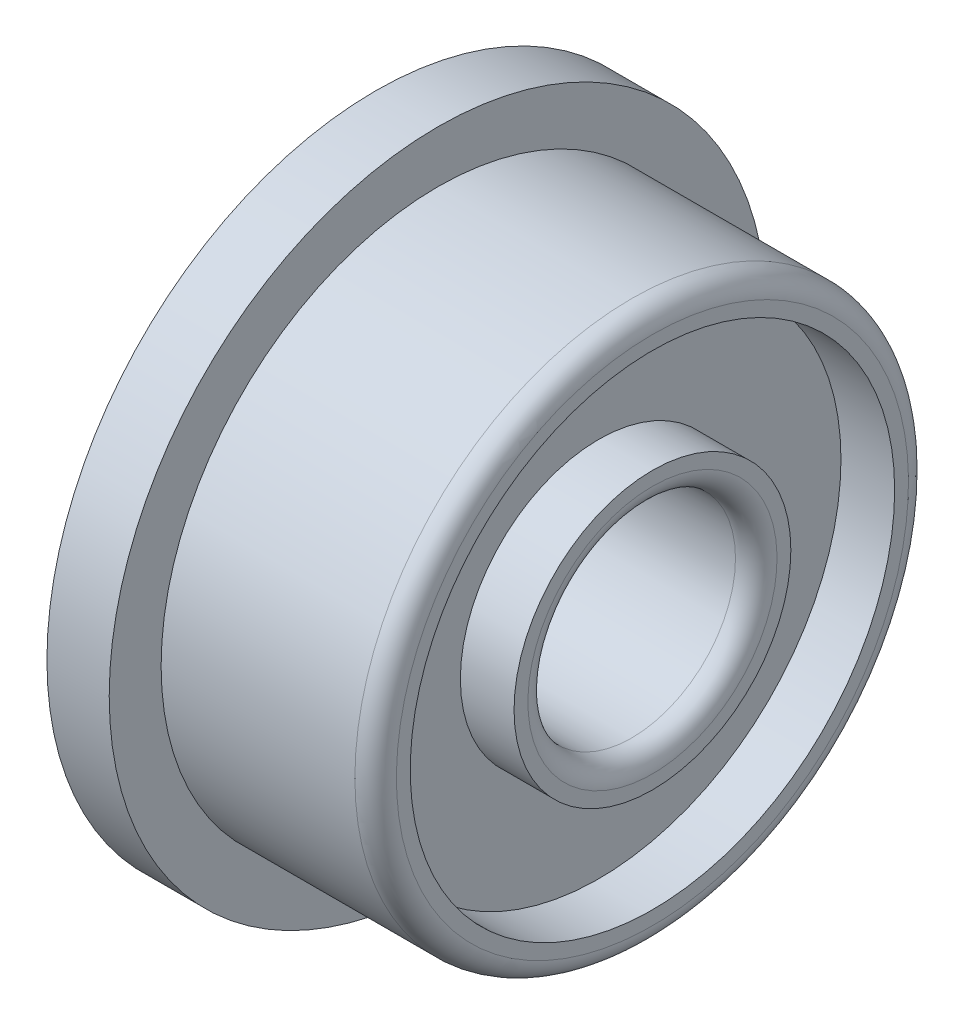
ISO-10303-21;
HEADER;
FILE_DESCRIPTION(('STEP AP214'),'2;1');
FILE_NAME('part.step','',(''),(''),'','','');
FILE_SCHEMA(('AUTOMOTIVE_DESIGN { 1 0 10303 214 1 1 1 1 }'));
ENDSEC;
DATA;
#1=APPLICATION_CONTEXT('core data for automotive mechanical design processes');
#2=APPLICATION_PROTOCOL_DEFINITION('international standard','automotive_design',2000,#1);
#3=PRODUCT_CONTEXT('',#1,'mechanical');
#4=PRODUCT('Part','Part','',(#3));
#5=PRODUCT_RELATED_PRODUCT_CATEGORY('part','',(#4));
#6=PRODUCT_DEFINITION_FORMATION('','',#4);
#7=PRODUCT_DEFINITION_CONTEXT('part definition',#1,'design');
#8=PRODUCT_DEFINITION('design','',#6,#7);
#9=PRODUCT_DEFINITION_SHAPE('','',#8);
#10=(LENGTH_UNIT() NAMED_UNIT(*) SI_UNIT(.MILLI.,.METRE.));
#11=(NAMED_UNIT(*) PLANE_ANGLE_UNIT() SI_UNIT($,.RADIAN.));
#12=(NAMED_UNIT(*) SI_UNIT($,.STERADIAN.) SOLID_ANGLE_UNIT());
#13=UNCERTAINTY_MEASURE_WITH_UNIT(LENGTH_MEASURE(1.E-05),#10,'distance_accuracy_value','');
#14=(GEOMETRIC_REPRESENTATION_CONTEXT(3) GLOBAL_UNCERTAINTY_ASSIGNED_CONTEXT((#13)) GLOBAL_UNIT_ASSIGNED_CONTEXT((#10,
#11,#12)) REPRESENTATION_CONTEXT('',''));
#15=CARTESIAN_POINT('',(0.,0.,0.));
#16=DIRECTION('',(0.,0.,1.));
#17=DIRECTION('',(1.,0.,0.));
#18=AXIS2_PLACEMENT_3D('',#15,#16,#17);
#19=CARTESIAN_POINT('',(0.,1.94454364826301,1.94454364826301));
#20=DIRECTION('',(1.,0.,0.));
#21=DIRECTION('',(0.,-0.707106781186548,0.707106781186548));
#22=AXIS2_PLACEMENT_3D('',#19,#20,#21);
#23=SPHERICAL_SURFACE('',#22,0.75);
#24=CARTESIAN_POINT('',(-0.749999999999993,1.94454364826301,1.94454364826301));
#25=VERTEX_POINT('',#24);
#26=VERTEX_LOOP('',#25);
#27=FACE_BOUND('',#26,.T.);
#28=CARTESIAN_POINT('',(0.750000000000007,1.94454364826301,1.94454364826301));
#29=VERTEX_POINT('',#28);
#30=VERTEX_LOOP('',#29);
#31=FACE_BOUND('',#30,.T.);
#32=ADVANCED_FACE('P0_F15',(#27,#31),#23,.T.);
#33=CLOSED_SHELL('',(#32));
#34=MANIFOLD_SOLID_BREP('P0_B1',#33);
#35=CARTESIAN_POINT('',(0.,0.,2.75));
#36=DIRECTION('',(1.,0.,0.));
#37=DIRECTION('',(0.,-1.,0.));
#38=AXIS2_PLACEMENT_3D('',#35,#36,#37);
#39=SPHERICAL_SURFACE('',#38,0.75);
#40=CARTESIAN_POINT('',(-0.749999999999993,0.,2.75));
#41=VERTEX_POINT('',#40);
#42=VERTEX_LOOP('',#41);
#43=FACE_BOUND('',#42,.T.);
#44=CARTESIAN_POINT('',(0.750000000000007,0.,2.75));
#45=VERTEX_POINT('',#44);
#46=VERTEX_LOOP('',#45);
#47=FACE_BOUND('',#46,.T.);
#48=ADVANCED_FACE('P1_F15',(#43,#47),#39,.T.);
#49=CLOSED_SHELL('',(#48));
#50=MANIFOLD_SOLID_BREP('P1_B1',#49);
#51=CARTESIAN_POINT('',(0.,-1.94454364826301,1.94454364826301));
#52=DIRECTION('',(1.,0.,0.));
#53=DIRECTION('',(0.,-0.707106781186548,-0.707106781186548));
#54=AXIS2_PLACEMENT_3D('',#51,#52,#53);
#55=SPHERICAL_SURFACE('',#54,0.75);
#56=CARTESIAN_POINT('',(-0.749999999999993,-1.94454364826301,1.94454364826301));
#57=VERTEX_POINT('',#56);
#58=VERTEX_LOOP('',#57);
#59=FACE_BOUND('',#58,.T.);
#60=CARTESIAN_POINT('',(0.750000000000007,-1.94454364826301,1.94454364826301));
#61=VERTEX_POINT('',#60);
#62=VERTEX_LOOP('',#61);
#63=FACE_BOUND('',#62,.T.);
#64=ADVANCED_FACE('P2_F15',(#59,#63),#55,.T.);
#65=CLOSED_SHELL('',(#64));
#66=MANIFOLD_SOLID_BREP('P2_B1',#65);
#67=CARTESIAN_POINT('',(0.,-2.75,0.));
#68=DIRECTION('',(1.,0.,0.));
#69=DIRECTION('',(0.,0.,-1.));
#70=AXIS2_PLACEMENT_3D('',#67,#68,#69);
#71=SPHERICAL_SURFACE('',#70,0.75);
#72=CARTESIAN_POINT('',(-0.749999999999993,-2.75,0.));
#73=VERTEX_POINT('',#72);
#74=VERTEX_LOOP('',#73);
#75=FACE_BOUND('',#74,.T.);
#76=CARTESIAN_POINT('',(0.750000000000007,-2.75,0.));
#77=VERTEX_POINT('',#76);
#78=VERTEX_LOOP('',#77);
#79=FACE_BOUND('',#78,.T.);
#80=ADVANCED_FACE('P3_F15',(#75,#79),#71,.T.);
#81=CLOSED_SHELL('',(#80));
#82=MANIFOLD_SOLID_BREP('P3_B1',#81);
#83=CARTESIAN_POINT('',(0.,-1.94454364826301,-1.94454364826301));
#84=DIRECTION('',(1.,0.,0.));
#85=DIRECTION('',(0.,0.707106781186548,-0.707106781186548));
#86=AXIS2_PLACEMENT_3D('',#83,#84,#85);
#87=SPHERICAL_SURFACE('',#86,0.75);
#88=CARTESIAN_POINT('',(-0.749999999999993,-1.94454364826301,-1.94454364826301));
#89=VERTEX_POINT('',#88);
#90=VERTEX_LOOP('',#89);
#91=FACE_BOUND('',#90,.T.);
#92=CARTESIAN_POINT('',(0.750000000000007,-1.94454364826301,-1.94454364826301));
#93=VERTEX_POINT('',#92);
#94=VERTEX_LOOP('',#93);
#95=FACE_BOUND('',#94,.T.);
#96=ADVANCED_FACE('P4_F15',(#91,#95),#87,.T.);
#97=CLOSED_SHELL('',(#96));
#98=MANIFOLD_SOLID_BREP('P4_B1',#97);
#99=CARTESIAN_POINT('',(0.,0.,-2.75));
#100=DIRECTION('',(1.,0.,0.));
#101=DIRECTION('',(0.,1.,0.));
#102=AXIS2_PLACEMENT_3D('',#99,#100,#101);
#103=SPHERICAL_SURFACE('',#102,0.75);
#104=CARTESIAN_POINT('',(-0.749999999999993,0.,-2.75));
#105=VERTEX_POINT('',#104);
#106=VERTEX_LOOP('',#105);
#107=FACE_BOUND('',#106,.T.);
#108=CARTESIAN_POINT('',(0.750000000000007,0.,-2.75));
#109=VERTEX_POINT('',#108);
#110=VERTEX_LOOP('',#109);
#111=FACE_BOUND('',#110,.T.);
#112=ADVANCED_FACE('P5_F15',(#107,#111),#103,.T.);
#113=CLOSED_SHELL('',(#112));
#114=MANIFOLD_SOLID_BREP('P5_B1',#113);
#115=CARTESIAN_POINT('',(0.,1.94454364826301,-1.94454364826301));
#116=DIRECTION('',(1.,0.,0.));
#117=DIRECTION('',(0.,0.707106781186548,0.707106781186548));
#118=AXIS2_PLACEMENT_3D('',#115,#116,#117);
#119=SPHERICAL_SURFACE('',#118,0.75);
#120=CARTESIAN_POINT('',(-0.749999999999993,1.94454364826301,-1.94454364826301));
#121=VERTEX_POINT('',#120);
#122=VERTEX_LOOP('',#121);
#123=FACE_BOUND('',#122,.T.);
#124=CARTESIAN_POINT('',(0.750000000000007,1.94454364826301,-1.94454364826301));
#125=VERTEX_POINT('',#124);
#126=VERTEX_LOOP('',#125);
#127=FACE_BOUND('',#126,.T.);
#128=ADVANCED_FACE('P6_F15',(#123,#127),#119,.T.);
#129=CLOSED_SHELL('',(#128));
#130=MANIFOLD_SOLID_BREP('P6_B1',#129);
#131=CARTESIAN_POINT('',(-1.07407407407407,0.,0.));
#132=DIRECTION('',(1.,0.,0.));
#133=DIRECTION('',(0.,0.,-1.));
#134=AXIS2_PLACEMENT_3D('',#131,#132,#133);
#135=PLANE('',#134);
#136=CARTESIAN_POINT('',(-1.07407407407407,0.,0.));
#137=DIRECTION('',(-1.,0.,0.));
#138=DIRECTION('',(0.,0.,1.));
#139=AXIS2_PLACEMENT_3D('',#136,#137,#138);
#140=CIRCLE('',#139,2.);
#141=CARTESIAN_POINT('',(-1.07407407407407,0.,2.));
#142=VERTEX_POINT('',#141);
#143=EDGE_CURVE('P7_E26',#142,#142,#140,.T.);
#144=ORIENTED_EDGE('',*,*,#143,.T.);
#145=EDGE_LOOP('',(#144));
#146=FACE_BOUND('',#145,.T.);
#147=CARTESIAN_POINT('',(-1.07407407407407,0.,0.));
#148=DIRECTION('',(-1.,0.,0.));
#149=DIRECTION('',(0.,0.,1.));
#150=AXIS2_PLACEMENT_3D('',#147,#148,#149);
#151=CIRCLE('',#150,3.65);
#152=CARTESIAN_POINT('',(-1.07407407407407,0.,3.65));
#153=VERTEX_POINT('',#152);
#154=EDGE_CURVE('P7_E17',#153,#153,#151,.T.);
#155=ORIENTED_EDGE('',*,*,#154,.F.);
#156=EDGE_LOOP('',(#155));
#157=FACE_BOUND('',#156,.T.);
#158=ADVANCED_FACE('P7_F14',(#146,#157),#135,.T.);
#159=CARTESIAN_POINT('',(-1.07407407407407,0.,0.));
#160=DIRECTION('',(-1.,0.,0.));
#161=DIRECTION('',(0.,0.,1.));
#162=AXIS2_PLACEMENT_3D('',#159,#160,#161);
#163=CYLINDRICAL_SURFACE('',#162,3.65);
#164=ORIENTED_EDGE('',*,*,#154,.T.);
#165=EDGE_LOOP('',(#164));
#166=FACE_BOUND('',#165,.T.);
#167=CARTESIAN_POINT('',(-1.22407407407408,0.,0.));
#168=DIRECTION('',(-1.,0.,0.));
#169=DIRECTION('',(0.,0.,1.));
#170=AXIS2_PLACEMENT_3D('',#167,#168,#169);
#171=CIRCLE('',#170,3.65);
#172=CARTESIAN_POINT('',(-1.22407407407408,0.,3.65));
#173=VERTEX_POINT('',#172);
#174=EDGE_CURVE('P7_E21',#173,#173,#171,.T.);
#175=ORIENTED_EDGE('',*,*,#174,.F.);
#176=EDGE_LOOP('',(#175));
#177=FACE_BOUND('',#176,.T.);
#178=ADVANCED_FACE('P7_F34',(#166,#177),#163,.T.);
#179=CARTESIAN_POINT('',(-1.22407407407408,0.,0.));
#180=DIRECTION('',(-1.,0.,0.));
#181=DIRECTION('',(0.,0.,1.));
#182=AXIS2_PLACEMENT_3D('',#179,#180,#181);
#183=CYLINDRICAL_SURFACE('',#182,2.);
#184=ORIENTED_EDGE('',*,*,#143,.F.);
#185=EDGE_LOOP('',(#184));
#186=FACE_BOUND('',#185,.T.);
#187=CARTESIAN_POINT('',(-1.22407407407408,0.,0.));
#188=DIRECTION('',(-1.,0.,0.));
#189=DIRECTION('',(0.,0.,1.));
#190=AXIS2_PLACEMENT_3D('',#187,#188,#189);
#191=CIRCLE('',#190,2.);
#192=CARTESIAN_POINT('',(-1.22407407407408,0.,2.));
#193=VERTEX_POINT('',#192);
#194=EDGE_CURVE('P7_E10',#193,#193,#191,.F.);
#195=ORIENTED_EDGE('',*,*,#194,.F.);
#196=EDGE_LOOP('',(#195));
#197=FACE_BOUND('',#196,.T.);
#198=ADVANCED_FACE('P7_F42',(#186,#197),#183,.F.);
#199=CARTESIAN_POINT('',(-1.22407407407408,0.,0.));
#200=DIRECTION('',(-1.,0.,0.));
#201=DIRECTION('',(0.,0.,1.));
#202=AXIS2_PLACEMENT_3D('',#199,#200,#201);
#203=PLANE('',#202);
#204=ORIENTED_EDGE('',*,*,#194,.T.);
#205=EDGE_LOOP('',(#204));
#206=FACE_BOUND('',#205,.T.);
#207=ORIENTED_EDGE('',*,*,#174,.T.);
#208=EDGE_LOOP('',(#207));
#209=FACE_BOUND('',#208,.T.);
#210=ADVANCED_FACE('P7_F43',(#206,#209),#203,.T.);
#211=CLOSED_SHELL('',(#158,#178,#198,#210));
#212=MANIFOLD_SOLID_BREP('P7_B1',#211);
#213=CARTESIAN_POINT('',(1.07407407407407,0.,0.));
#214=DIRECTION('',(-1.,0.,0.));
#215=DIRECTION('',(0.,0.,1.));
#216=AXIS2_PLACEMENT_3D('',#213,#214,#215);
#217=PLANE('',#216);
#218=CARTESIAN_POINT('',(1.07407407407407,0.,0.));
#219=DIRECTION('',(1.,0.,0.));
#220=DIRECTION('',(0.,0.,-1.));
#221=AXIS2_PLACEMENT_3D('',#218,#219,#220);
#222=CIRCLE('',#221,2.);
#223=CARTESIAN_POINT('',(1.07407407407407,0.,-2.));
#224=VERTEX_POINT('',#223);
#225=EDGE_CURVE('P8_E26',#224,#224,#222,.T.);
#226=ORIENTED_EDGE('',*,*,#225,.T.);
#227=EDGE_LOOP('',(#226));
#228=FACE_BOUND('',#227,.T.);
#229=CARTESIAN_POINT('',(1.07407407407407,0.,0.));
#230=DIRECTION('',(1.,0.,0.));
#231=DIRECTION('',(0.,0.,-1.));
#232=AXIS2_PLACEMENT_3D('',#229,#230,#231);
#233=CIRCLE('',#232,3.65);
#234=CARTESIAN_POINT('',(1.07407407407407,0.,-3.65));
#235=VERTEX_POINT('',#234);
#236=EDGE_CURVE('P8_E17',#235,#235,#233,.T.);
#237=ORIENTED_EDGE('',*,*,#236,.F.);
#238=EDGE_LOOP('',(#237));
#239=FACE_BOUND('',#238,.T.);
#240=ADVANCED_FACE('P8_F14',(#228,#239),#217,.T.);
#241=CARTESIAN_POINT('',(1.07407407407407,0.,0.));
#242=DIRECTION('',(1.,0.,0.));
#243=DIRECTION('',(0.,0.,-1.));
#244=AXIS2_PLACEMENT_3D('',#241,#242,#243);
#245=CYLINDRICAL_SURFACE('',#244,3.65);
#246=ORIENTED_EDGE('',*,*,#236,.T.);
#247=EDGE_LOOP('',(#246));
#248=FACE_BOUND('',#247,.T.);
#249=CARTESIAN_POINT('',(1.22407407407408,0.,0.));
#250=DIRECTION('',(1.,0.,0.));
#251=DIRECTION('',(0.,0.,-1.));
#252=AXIS2_PLACEMENT_3D('',#249,#250,#251);
#253=CIRCLE('',#252,3.65);
#254=CARTESIAN_POINT('',(1.22407407407408,0.,-3.65));
#255=VERTEX_POINT('',#254);
#256=EDGE_CURVE('P8_E21',#255,#255,#253,.T.);
#257=ORIENTED_EDGE('',*,*,#256,.F.);
#258=EDGE_LOOP('',(#257));
#259=FACE_BOUND('',#258,.T.);
#260=ADVANCED_FACE('P8_F34',(#248,#259),#245,.T.);
#261=CARTESIAN_POINT('',(1.22407407407408,0.,0.));
#262=DIRECTION('',(1.,0.,0.));
#263=DIRECTION('',(0.,0.,-1.));
#264=AXIS2_PLACEMENT_3D('',#261,#262,#263);
#265=CYLINDRICAL_SURFACE('',#264,2.);
#266=ORIENTED_EDGE('',*,*,#225,.F.);
#267=EDGE_LOOP('',(#266));
#268=FACE_BOUND('',#267,.T.);
#269=CARTESIAN_POINT('',(1.22407407407408,0.,0.));
#270=DIRECTION('',(1.,0.,0.));
#271=DIRECTION('',(0.,0.,-1.));
#272=AXIS2_PLACEMENT_3D('',#269,#270,#271);
#273=CIRCLE('',#272,2.);
#274=CARTESIAN_POINT('',(1.22407407407408,0.,-2.));
#275=VERTEX_POINT('',#274);
#276=EDGE_CURVE('P8_E10',#275,#275,#273,.F.);
#277=ORIENTED_EDGE('',*,*,#276,.F.);
#278=EDGE_LOOP('',(#277));
#279=FACE_BOUND('',#278,.T.);
#280=ADVANCED_FACE('P8_F42',(#268,#279),#265,.F.);
#281=CARTESIAN_POINT('',(1.22407407407408,0.,0.));
#282=DIRECTION('',(1.,0.,0.));
#283=DIRECTION('',(0.,0.,-1.));
#284=AXIS2_PLACEMENT_3D('',#281,#282,#283);
#285=PLANE('',#284);
#286=ORIENTED_EDGE('',*,*,#276,.T.);
#287=EDGE_LOOP('',(#286));
#288=FACE_BOUND('',#287,.T.);
#289=ORIENTED_EDGE('',*,*,#256,.T.);
#290=EDGE_LOOP('',(#289));
#291=FACE_BOUND('',#290,.T.);
#292=ADVANCED_FACE('P8_F43',(#288,#291),#285,.T.);
#293=CLOSED_SHELL('',(#240,#260,#280,#292));
#294=MANIFOLD_SOLID_BREP('P8_B1',#293);
#295=CARTESIAN_POINT('',(0.,2.75,0.));
#296=DIRECTION('',(1.,0.,0.));
#297=DIRECTION('',(0.,0.,1.));
#298=AXIS2_PLACEMENT_3D('',#295,#296,#297);
#299=SPHERICAL_SURFACE('',#298,0.75);
#300=CARTESIAN_POINT('',(-0.749999999999993,2.75,0.));
#301=VERTEX_POINT('',#300);
#302=VERTEX_LOOP('',#301);
#303=FACE_BOUND('',#302,.T.);
#304=CARTESIAN_POINT('',(0.750000000000007,2.75,0.));
#305=VERTEX_POINT('',#304);
#306=VERTEX_LOOP('',#305);
#307=FACE_BOUND('',#306,.T.);
#308=ADVANCED_FACE('P9_F15',(#303,#307),#299,.T.);
#309=CLOSED_SHELL('',(#308));
#310=MANIFOLD_SOLID_BREP('P9_B1',#309);
#311=CARTESIAN_POINT('',(0.,0.,0.));
#312=DIRECTION('',(1.,0.,0.));
#313=DIRECTION('',(0.,1.,0.));
#314=AXIS2_PLACEMENT_3D('',#311,#312,#313);
#315=TOROIDAL_SURFACE('',#314,2.75,0.75);
#316=CARTESIAN_POINT('',(-0.481534007106452,0.,0.));
#317=DIRECTION('',(1.,0.,0.));
#318=DIRECTION('',(0.,0.,-1.));
#319=AXIS2_PLACEMENT_3D('',#316,#317,#318);
#320=CIRCLE('',#319,3.325);
#321=CARTESIAN_POINT('',(-0.481534007106452,0.,-3.325));
#322=VERTEX_POINT('',#321);
#323=EDGE_CURVE('P10_E70',#322,#322,#320,.F.);
#324=ORIENTED_EDGE('',*,*,#323,.T.);
#325=EDGE_LOOP('',(#324));
#326=FACE_BOUND('',#325,.T.);
#327=CARTESIAN_POINT('',(0.481534007106451,0.,0.));
#328=DIRECTION('',(1.,0.,0.));
#329=DIRECTION('',(0.,0.,-1.));
#330=AXIS2_PLACEMENT_3D('',#327,#328,#329);
#331=CIRCLE('',#330,3.325);
#332=CARTESIAN_POINT('',(0.481534007106451,0.,-3.325));
#333=VERTEX_POINT('',#332);
#334=EDGE_CURVE('P10_E66',#333,#333,#331,.T.);
#335=ORIENTED_EDGE('',*,*,#334,.T.);
#336=EDGE_LOOP('',(#335));
#337=FACE_BOUND('',#336,.T.);
#338=ADVANCED_FACE('P10_F14',(#326,#337),#315,.F.);
#339=CARTESIAN_POINT('',(2.00000000000003,0.,0.));
#340=DIRECTION('',(1.,0.,0.));
#341=DIRECTION('',(0.,0.,-1.));
#342=AXIS2_PLACEMENT_3D('',#339,#340,#341);
#343=CYLINDRICAL_SURFACE('',#342,3.325);
#344=CARTESIAN_POINT('',(-1.07407407407407,0.,0.));
#345=DIRECTION('',(1.,0.,0.));
#346=DIRECTION('',(0.,0.,-1.));
#347=AXIS2_PLACEMENT_3D('',#344,#345,#346);
#348=CIRCLE('',#347,3.325);
#349=CARTESIAN_POINT('',(-1.07407407407407,0.,-3.325));
#350=VERTEX_POINT('',#349);
#351=EDGE_CURVE('P10_E18',#350,#350,#348,.F.);
#352=ORIENTED_EDGE('',*,*,#351,.T.);
#353=EDGE_LOOP('',(#352));
#354=FACE_BOUND('',#353,.T.);
#355=ORIENTED_EDGE('',*,*,#323,.F.);
#356=EDGE_LOOP('',(#355));
#357=FACE_BOUND('',#356,.T.);
#358=ADVANCED_FACE('P10_F158',(#354,#357),#343,.F.);
#359=CARTESIAN_POINT('',(2.00000000000003,0.,0.));
#360=DIRECTION('',(1.,0.,0.));
#361=DIRECTION('',(0.,0.,-1.));
#362=AXIS2_PLACEMENT_3D('',#359,#360,#361);
#363=CYLINDRICAL_SURFACE('',#362,3.325);
#364=ORIENTED_EDGE('',*,*,#334,.F.);
#365=EDGE_LOOP('',(#364));
#366=FACE_BOUND('',#365,.T.);
#367=CARTESIAN_POINT('',(1.07407407407408,0.,0.));
#368=DIRECTION('',(1.,0.,0.));
#369=DIRECTION('',(0.,0.,-1.));
#370=AXIS2_PLACEMENT_3D('',#367,#368,#369);
#371=CIRCLE('',#370,3.325);
#372=CARTESIAN_POINT('',(1.07407407407408,0.,-3.325));
#373=VERTEX_POINT('',#372);
#374=EDGE_CURVE('P10_E61',#373,#373,#371,.T.);
#375=ORIENTED_EDGE('',*,*,#374,.T.);
#376=EDGE_LOOP('',(#375));
#377=FACE_BOUND('',#376,.T.);
#378=ADVANCED_FACE('P10_F155',(#366,#377),#363,.F.);
#379=CARTESIAN_POINT('',(-1.07407407407407,0.,0.));
#380=DIRECTION('',(1.,0.,0.));
#381=DIRECTION('',(0.,0.,-1.));
#382=AXIS2_PLACEMENT_3D('',#379,#380,#381);
#383=PLANE('',#382);
#384=ORIENTED_EDGE('',*,*,#351,.F.);
#385=EDGE_LOOP('',(#384));
#386=FACE_BOUND('',#385,.T.);
#387=CARTESIAN_POINT('',(-1.07407407407406,0.,0.));
#388=DIRECTION('',(1.,0.,0.));
#389=DIRECTION('',(0.,0.,-1.));
#390=AXIS2_PLACEMENT_3D('',#387,#388,#389);
#391=CIRCLE('',#390,3.64999999999998);
#392=CARTESIAN_POINT('',(-1.07407407407406,0.,-3.64999999999998));
#393=VERTEX_POINT('',#392);
#394=EDGE_CURVE('P10_E59',#393,#393,#391,.F.);
#395=ORIENTED_EDGE('',*,*,#394,.T.);
#396=EDGE_LOOP('',(#395));
#397=FACE_BOUND('',#396,.T.);
#398=ADVANCED_FACE('P10_F151',(#386,#397),#383,.F.);
#399=CARTESIAN_POINT('',(1.07407407407408,0.,0.));
#400=DIRECTION('',(-1.,0.,0.));
#401=DIRECTION('',(0.,0.,1.));
#402=AXIS2_PLACEMENT_3D('',#399,#400,#401);
#403=PLANE('',#402);
#404=ORIENTED_EDGE('',*,*,#374,.F.);
#405=EDGE_LOOP('',(#404));
#406=FACE_BOUND('',#405,.T.);
#407=CARTESIAN_POINT('',(1.07407407407408,0.,0.));
#408=DIRECTION('',(1.,0.,0.));
#409=DIRECTION('',(0.,0.,-1.));
#410=AXIS2_PLACEMENT_3D('',#407,#408,#409);
#411=CIRCLE('',#410,3.64999999999999);
#412=CARTESIAN_POINT('',(1.07407407407408,0.,-3.64999999999999));
#413=VERTEX_POINT('',#412);
#414=EDGE_CURVE('P10_E56',#413,#413,#411,.T.);
#415=ORIENTED_EDGE('',*,*,#414,.T.);
#416=EDGE_LOOP('',(#415));
#417=FACE_BOUND('',#416,.T.);
#418=ADVANCED_FACE('P10_F147',(#406,#417),#403,.F.);
#419=CARTESIAN_POINT('',(-1.22407407407407,0.,0.));
#420=DIRECTION('',(1.,0.,0.));
#421=DIRECTION('',(0.,0.,-1.));
#422=AXIS2_PLACEMENT_3D('',#419,#420,#421);
#423=CYLINDRICAL_SURFACE('',#422,3.64999999999998);
#424=CARTESIAN_POINT('',(-1.22407407407407,0.,0.));
#425=DIRECTION('',(1.,0.,0.));
#426=DIRECTION('',(0.,0.,-1.));
#427=AXIS2_PLACEMENT_3D('',#424,#425,#426);
#428=CIRCLE('',#427,3.64999999999998);
#429=CARTESIAN_POINT('',(-1.22407407407407,0.,-3.64999999999998));
#430=VERTEX_POINT('',#429);
#431=EDGE_CURVE('P10_E53',#430,#430,#428,.F.);
#432=ORIENTED_EDGE('',*,*,#431,.T.);
#433=EDGE_LOOP('',(#432));
#434=FACE_BOUND('',#433,.T.);
#435=ORIENTED_EDGE('',*,*,#394,.F.);
#436=EDGE_LOOP('',(#435));
#437=FACE_BOUND('',#436,.T.);
#438=ADVANCED_FACE('P10_F143',(#434,#437),#423,.F.);
#439=CARTESIAN_POINT('',(1.07407407407408,0.,0.));
#440=DIRECTION('',(1.,0.,0.));
#441=DIRECTION('',(0.,0.,-1.));
#442=AXIS2_PLACEMENT_3D('',#439,#440,#441);
#443=CYLINDRICAL_SURFACE('',#442,3.64999999999999);
#444=ORIENTED_EDGE('',*,*,#414,.F.);
#445=EDGE_LOOP('',(#444));
#446=FACE_BOUND('',#445,.T.);
#447=CARTESIAN_POINT('',(1.22407407407407,0.,0.));
#448=DIRECTION('',(1.,0.,0.));
#449=DIRECTION('',(0.,0.,-1.));
#450=AXIS2_PLACEMENT_3D('',#447,#448,#449);
#451=CIRCLE('',#450,3.64999999999999);
#452=CARTESIAN_POINT('',(1.22407407407407,0.,-3.64999999999999));
#453=VERTEX_POINT('',#452);
#454=EDGE_CURVE('P10_E50',#453,#453,#451,.T.);
#455=ORIENTED_EDGE('',*,*,#454,.T.);
#456=EDGE_LOOP('',(#455));
#457=FACE_BOUND('',#456,.T.);
#458=ADVANCED_FACE('P10_F139',(#446,#457),#443,.F.);
#459=CARTESIAN_POINT('',(-1.22407407407407,0.,0.));
#460=DIRECTION('',(-1.,0.,0.));
#461=DIRECTION('',(0.,0.,1.));
#462=AXIS2_PLACEMENT_3D('',#459,#460,#461);
#463=PLANE('',#462);
#464=CARTESIAN_POINT('',(-1.22407407407407,0.,0.));
#465=DIRECTION('',(1.,0.,0.));
#466=DIRECTION('',(0.,0.,-1.));
#467=AXIS2_PLACEMENT_3D('',#464,#465,#466);
#468=CIRCLE('',#467,3.5);
#469=CARTESIAN_POINT('',(-1.22407407407407,0.,-3.5));
#470=VERTEX_POINT('',#469);
#471=EDGE_CURVE('P10_E47',#470,#470,#468,.F.);
#472=ORIENTED_EDGE('',*,*,#471,.T.);
#473=EDGE_LOOP('',(#472));
#474=FACE_BOUND('',#473,.T.);
#475=ORIENTED_EDGE('',*,*,#431,.F.);
#476=EDGE_LOOP('',(#475));
#477=FACE_BOUND('',#476,.T.);
#478=ADVANCED_FACE('P10_F135',(#474,#477),#463,.F.);
#479=CARTESIAN_POINT('',(1.22407407407407,0.,0.));
#480=DIRECTION('',(1.,0.,0.));
#481=DIRECTION('',(0.,0.,-1.));
#482=AXIS2_PLACEMENT_3D('',#479,#480,#481);
#483=PLANE('',#482);
#484=CARTESIAN_POINT('',(1.22407407407407,0.,0.));
#485=DIRECTION('',(1.,0.,0.));
#486=DIRECTION('',(0.,0.,-1.));
#487=AXIS2_PLACEMENT_3D('',#484,#485,#486);
#488=CIRCLE('',#487,3.49999999999999);
#489=CARTESIAN_POINT('',(1.22407407407407,0.,-3.49999999999999));
#490=VERTEX_POINT('',#489);
#491=EDGE_CURVE('P10_E44',#490,#490,#488,.T.);
#492=ORIENTED_EDGE('',*,*,#491,.T.);
#493=EDGE_LOOP('',(#492));
#494=FACE_BOUND('',#493,.T.);
#495=ORIENTED_EDGE('',*,*,#454,.F.);
#496=EDGE_LOOP('',(#495));
#497=FACE_BOUND('',#496,.T.);
#498=ADVANCED_FACE('P10_F131',(#494,#497),#483,.F.);
#499=CARTESIAN_POINT('',(-2.,0.,0.));
#500=DIRECTION('',(1.,0.,0.));
#501=DIRECTION('',(0.,0.,-1.));
#502=AXIS2_PLACEMENT_3D('',#499,#500,#501);
#503=CYLINDRICAL_SURFACE('',#502,3.5);
#504=CARTESIAN_POINT('',(-2.,0.,0.));
#505=DIRECTION('',(1.,0.,0.));
#506=DIRECTION('',(0.,0.,-1.));
#507=AXIS2_PLACEMENT_3D('',#504,#505,#506);
#508=CIRCLE('',#507,3.5);
#509=CARTESIAN_POINT('',(-2.,0.,-3.5));
#510=VERTEX_POINT('',#509);
#511=EDGE_CURVE('P10_E41',#510,#510,#508,.T.);
#512=ORIENTED_EDGE('',*,*,#511,.F.);
#513=EDGE_LOOP('',(#512));
#514=FACE_BOUND('',#513,.T.);
#515=ORIENTED_EDGE('',*,*,#471,.F.);
#516=EDGE_LOOP('',(#515));
#517=FACE_BOUND('',#516,.T.);
#518=ADVANCED_FACE('P10_F127',(#514,#517),#503,.F.);
#519=CARTESIAN_POINT('',(1.22407407407407,0.,0.));
#520=DIRECTION('',(1.,0.,0.));
#521=DIRECTION('',(0.,0.,-1.));
#522=AXIS2_PLACEMENT_3D('',#519,#520,#521);
#523=CYLINDRICAL_SURFACE('',#522,3.49999999999999);
#524=ORIENTED_EDGE('',*,*,#491,.F.);
#525=EDGE_LOOP('',(#524));
#526=FACE_BOUND('',#525,.T.);
#527=CARTESIAN_POINT('',(2.,0.,0.));
#528=DIRECTION('',(1.,0.,0.));
#529=DIRECTION('',(0.,0.,-1.));
#530=AXIS2_PLACEMENT_3D('',#527,#528,#529);
#531=CIRCLE('',#530,3.49999999999999);
#532=CARTESIAN_POINT('',(2.,0.,-3.49999999999999));
#533=VERTEX_POINT('',#532);
#534=EDGE_CURVE('P10_E38',#533,#533,#531,.F.);
#535=ORIENTED_EDGE('',*,*,#534,.F.);
#536=EDGE_LOOP('',(#535));
#537=FACE_BOUND('',#536,.T.);
#538=ADVANCED_FACE('P10_F123',(#526,#537),#523,.F.);
#539=CARTESIAN_POINT('',(-1.99999999999999,0.,0.));
#540=DIRECTION('',(-1.,0.,0.));
#541=DIRECTION('',(0.,0.,1.));
#542=AXIS2_PLACEMENT_3D('',#539,#540,#541);
#543=PLANE('',#542);
#544=ORIENTED_EDGE('',*,*,#511,.T.);
#545=EDGE_LOOP('',(#544));
#546=FACE_BOUND('',#545,.T.);
#547=CARTESIAN_POINT('',(-1.99999999999999,0.,0.));
#548=DIRECTION('',(1.,0.,0.));
#549=DIRECTION('',(0.,0.,-1.));
#550=AXIS2_PLACEMENT_3D('',#547,#548,#549);
#551=CIRCLE('',#550,4.75000000000001);
#552=CARTESIAN_POINT('',(-1.99999999999999,0.,-4.75000000000001));
#553=VERTEX_POINT('',#552);
#554=EDGE_CURVE('P10_E35',#553,#553,#551,.T.);
#555=ORIENTED_EDGE('',*,*,#554,.F.);
#556=EDGE_LOOP('',(#555));
#557=FACE_BOUND('',#556,.T.);
#558=ADVANCED_FACE('P10_F119',(#546,#557),#543,.T.);
#559=CARTESIAN_POINT('',(2.00000000000003,0.,0.));
#560=DIRECTION('',(1.,0.,0.));
#561=DIRECTION('',(0.,0.,-1.));
#562=AXIS2_PLACEMENT_3D('',#559,#560,#561);
#563=PLANE('',#562);
#564=ORIENTED_EDGE('',*,*,#534,.T.);
#565=EDGE_LOOP('',(#564));
#566=FACE_BOUND('',#565,.T.);
#567=CARTESIAN_POINT('',(2.00000000000003,0.,0.));
#568=DIRECTION('',(-1.,0.,0.));
#569=DIRECTION('',(0.,1.,0.));
#570=AXIS2_PLACEMENT_3D('',#567,#568,#569);
#571=CIRCLE('',#570,3.7);
#572=CARTESIAN_POINT('',(2.00000000000003,3.7,0.));
#573=VERTEX_POINT('',#572);
#574=EDGE_CURVE('P10_E34',#573,#573,#571,.T.);
#575=ORIENTED_EDGE('',*,*,#574,.F.);
#576=EDGE_LOOP('',(#575));
#577=FACE_BOUND('',#576,.T.);
#578=ADVANCED_FACE('P10_F110',(#566,#577),#563,.T.);
#579=CARTESIAN_POINT('',(-1.99999999999999,0.,0.));
#580=DIRECTION('',(1.,0.,0.));
#581=DIRECTION('',(0.,0.,-1.));
#582=AXIS2_PLACEMENT_3D('',#579,#580,#581);
#583=CYLINDRICAL_SURFACE('',#582,4.75000000000001);
#584=ORIENTED_EDGE('',*,*,#554,.T.);
#585=EDGE_LOOP('',(#584));
#586=FACE_BOUND('',#585,.T.);
#587=CARTESIAN_POINT('',(-1.09999999999999,0.,0.));
#588=DIRECTION('',(1.,0.,0.));
#589=DIRECTION('',(0.,0.,-1.));
#590=AXIS2_PLACEMENT_3D('',#587,#588,#589);
#591=CIRCLE('',#590,4.75000000000001);
#592=CARTESIAN_POINT('',(-1.09999999999999,0.,-4.75000000000001));
#593=VERTEX_POINT('',#592);
#594=EDGE_CURVE('P10_E27',#593,#593,#591,.T.);
#595=ORIENTED_EDGE('',*,*,#594,.F.);
#596=EDGE_LOOP('',(#595));
#597=FACE_BOUND('',#596,.T.);
#598=ADVANCED_FACE('P10_F98',(#586,#597),#583,.T.);
#599=CARTESIAN_POINT('',(1.70000000000003,0.,0.));
#600=DIRECTION('',(1.,0.,0.));
#601=DIRECTION('',(0.,1.,0.));
#602=AXIS2_PLACEMENT_3D('',#599,#600,#601);
#603=TOROIDAL_SURFACE('',#602,3.7,0.3);
#604=CARTESIAN_POINT('',(1.70000000000003,0.,0.));
#605=DIRECTION('',(1.,0.,0.));
#606=DIRECTION('',(0.,0.,-1.));
#607=AXIS2_PLACEMENT_3D('',#604,#605,#606);
#608=CIRCLE('',#607,4.);
#609=CARTESIAN_POINT('',(1.70000000000003,0.,-4.));
#610=VERTEX_POINT('',#609);
#611=EDGE_CURVE('P10_E22',#610,#610,#608,.F.);
#612=ORIENTED_EDGE('',*,*,#611,.F.);
#613=EDGE_LOOP('',(#612));
#614=FACE_BOUND('',#613,.T.);
#615=ORIENTED_EDGE('',*,*,#574,.T.);
#616=EDGE_LOOP('',(#615));
#617=FACE_BOUND('',#616,.T.);
#618=ADVANCED_FACE('P10_F86',(#614,#617),#603,.T.);
#619=CARTESIAN_POINT('',(-1.09999999999999,0.,0.));
#620=DIRECTION('',(1.,0.,0.));
#621=DIRECTION('',(0.,0.,-1.));
#622=AXIS2_PLACEMENT_3D('',#619,#620,#621);
#623=PLANE('',#622);
#624=CARTESIAN_POINT('',(-1.09999999999999,0.,0.));
#625=DIRECTION('',(1.,0.,0.));
#626=DIRECTION('',(0.,0.,-1.));
#627=AXIS2_PLACEMENT_3D('',#624,#625,#626);
#628=CIRCLE('',#627,4.);
#629=CARTESIAN_POINT('',(-1.09999999999999,0.,-4.));
#630=VERTEX_POINT('',#629);
#631=EDGE_CURVE('P10_E10',#630,#630,#628,.T.);
#632=ORIENTED_EDGE('',*,*,#631,.F.);
#633=EDGE_LOOP('',(#632));
#634=FACE_BOUND('',#633,.T.);
#635=ORIENTED_EDGE('',*,*,#594,.T.);
#636=EDGE_LOOP('',(#635));
#637=FACE_BOUND('',#636,.T.);
#638=ADVANCED_FACE('P10_F97',(#634,#637),#623,.T.);
#639=CARTESIAN_POINT('',(-1.99999999999999,0.,0.));
#640=DIRECTION('',(1.,0.,0.));
#641=DIRECTION('',(0.,0.,-1.));
#642=AXIS2_PLACEMENT_3D('',#639,#640,#641);
#643=CYLINDRICAL_SURFACE('',#642,4.);
#644=ORIENTED_EDGE('',*,*,#631,.T.);
#645=EDGE_LOOP('',(#644));
#646=FACE_BOUND('',#645,.T.);
#647=ORIENTED_EDGE('',*,*,#611,.T.);
#648=EDGE_LOOP('',(#647));
#649=FACE_BOUND('',#648,.T.);
#650=ADVANCED_FACE('P10_F167',(#646,#649),#643,.T.);
#651=CLOSED_SHELL('',(#338,#358,#378,#398,#418,#438,#458,#478,#498,#518,#538,#558,#578,#598,
#618,#638,#650));
#652=MANIFOLD_SOLID_BREP('P10_B1',#651);
#653=CARTESIAN_POINT('',(0.,0.,0.));
#654=DIRECTION('',(1.,0.,0.));
#655=DIRECTION('',(0.,1.,0.));
#656=AXIS2_PLACEMENT_3D('',#653,#654,#655);
#657=TOROIDAL_SURFACE('',#656,2.75,0.75);
#658=CARTESIAN_POINT('',(-0.481534007106446,0.,0.));
#659=DIRECTION('',(1.,0.,0.));
#660=DIRECTION('',(0.,0.,-1.));
#661=AXIS2_PLACEMENT_3D('',#658,#659,#660);
#662=CIRCLE('',#661,2.17499999999999);
#663=CARTESIAN_POINT('',(-0.481534007106446,0.,-2.17499999999999));
#664=VERTEX_POINT('',#663);
#665=EDGE_CURVE('P11_E140',#664,#664,#662,.F.);
#666=ORIENTED_EDGE('',*,*,#665,.F.);
#667=EDGE_LOOP('',(#666));
#668=FACE_BOUND('',#667,.T.);
#669=CARTESIAN_POINT('',(0.481534007106446,0.,0.));
#670=DIRECTION('',(1.,0.,0.));
#671=DIRECTION('',(0.,0.,-1.));
#672=AXIS2_PLACEMENT_3D('',#669,#670,#671);
#673=CIRCLE('',#672,2.17499999999999);
#674=CARTESIAN_POINT('',(0.481534007106446,0.,-2.17499999999999));
#675=VERTEX_POINT('',#674);
#676=EDGE_CURVE('P11_E143',#675,#675,#673,.T.);
#677=ORIENTED_EDGE('',*,*,#676,.F.);
#678=EDGE_LOOP('',(#677));
#679=FACE_BOUND('',#678,.T.);
#680=ADVANCED_FACE('P11_F14',(#668,#679),#657,.F.);
#681=CARTESIAN_POINT('',(-1.99999999999999,0.,0.));
#682=DIRECTION('',(1.,0.,0.));
#683=DIRECTION('',(0.,0.,-1.));
#684=AXIS2_PLACEMENT_3D('',#681,#682,#683);
#685=CYLINDRICAL_SURFACE('',#684,2.17499999999999);
#686=ORIENTED_EDGE('',*,*,#676,.T.);
#687=EDGE_LOOP('',(#686));
#688=FACE_BOUND('',#687,.T.);
#689=CARTESIAN_POINT('',(1.07407407407409,0.,0.));
#690=DIRECTION('',(1.,0.,0.));
#691=DIRECTION('',(0.,0.,-1.));
#692=AXIS2_PLACEMENT_3D('',#689,#690,#691);
#693=CIRCLE('',#692,2.17499999999999);
#694=CARTESIAN_POINT('',(1.07407407407409,0.,-2.17499999999999));
#695=VERTEX_POINT('',#694);
#696=EDGE_CURVE('P11_E18',#695,#695,#693,.F.);
#697=ORIENTED_EDGE('',*,*,#696,.T.);
#698=EDGE_LOOP('',(#697));
#699=FACE_BOUND('',#698,.T.);
#700=ADVANCED_FACE('P11_F100',(#688,#699),#685,.T.);
#701=CARTESIAN_POINT('',(-1.99999999999999,0.,0.));
#702=DIRECTION('',(1.,0.,0.));
#703=DIRECTION('',(0.,0.,-1.));
#704=AXIS2_PLACEMENT_3D('',#701,#702,#703);
#705=CYLINDRICAL_SURFACE('',#704,2.17499999999999);
#706=CARTESIAN_POINT('',(-1.07407407407407,0.,0.));
#707=DIRECTION('',(1.,0.,0.));
#708=DIRECTION('',(0.,0.,-1.));
#709=AXIS2_PLACEMENT_3D('',#706,#707,#708);
#710=CIRCLE('',#709,2.17499999999999);
#711=CARTESIAN_POINT('',(-1.07407407407407,0.,-2.17499999999999));
#712=VERTEX_POINT('',#711);
#713=EDGE_CURVE('P11_E136',#712,#712,#710,.T.);
#714=ORIENTED_EDGE('',*,*,#713,.T.);
#715=EDGE_LOOP('',(#714));
#716=FACE_BOUND('',#715,.T.);
#717=ORIENTED_EDGE('',*,*,#665,.T.);
#718=EDGE_LOOP('',(#717));
#719=FACE_BOUND('',#718,.T.);
#720=ADVANCED_FACE('P11_F97',(#716,#719),#705,.T.);
#721=CARTESIAN_POINT('',(1.07407407407409,0.,0.));
#722=DIRECTION('',(-1.,0.,0.));
#723=DIRECTION('',(0.,0.,1.));
#724=AXIS2_PLACEMENT_3D('',#721,#722,#723);
#725=PLANE('',#724);
#726=CARTESIAN_POINT('',(1.07407407407409,0.,0.));
#727=DIRECTION('',(1.,0.,0.));
#728=DIRECTION('',(0.,0.,-1.));
#729=AXIS2_PLACEMENT_3D('',#726,#727,#728);
#730=CIRCLE('',#729,1.99999999999999);
#731=CARTESIAN_POINT('',(1.07407407407409,0.,-1.99999999999999));
#732=VERTEX_POINT('',#731);
#733=EDGE_CURVE('P11_E134',#732,#732,#730,.T.);
#734=ORIENTED_EDGE('',*,*,#733,.F.);
#735=EDGE_LOOP('',(#734));
#736=FACE_BOUND('',#735,.T.);
#737=ORIENTED_EDGE('',*,*,#696,.F.);
#738=EDGE_LOOP('',(#737));
#739=FACE_BOUND('',#738,.T.);
#740=ADVANCED_FACE('P11_F93',(#736,#739),#725,.F.);
#741=CARTESIAN_POINT('',(-1.07407407407407,0.,0.));
#742=DIRECTION('',(1.,0.,0.));
#743=DIRECTION('',(0.,0.,-1.));
#744=AXIS2_PLACEMENT_3D('',#741,#742,#743);
#745=PLANE('',#744);
#746=CARTESIAN_POINT('',(-1.07407407407407,0.,0.));
#747=DIRECTION('',(1.,0.,0.));
#748=DIRECTION('',(0.,0.,-1.));
#749=AXIS2_PLACEMENT_3D('',#746,#747,#748);
#750=CIRCLE('',#749,2.);
#751=CARTESIAN_POINT('',(-1.07407407407407,0.,-2.));
#752=VERTEX_POINT('',#751);
#753=EDGE_CURVE('P11_E127',#752,#752,#750,.F.);
#754=ORIENTED_EDGE('',*,*,#753,.F.);
#755=EDGE_LOOP('',(#754));
#756=FACE_BOUND('',#755,.T.);
#757=ORIENTED_EDGE('',*,*,#713,.F.);
#758=EDGE_LOOP('',(#757));
#759=FACE_BOUND('',#758,.T.);
#760=ADVANCED_FACE('P11_F89',(#756,#759),#745,.F.);
#761=CARTESIAN_POINT('',(2.00000000000001,0.,0.));
#762=DIRECTION('',(1.,0.,0.));
#763=DIRECTION('',(0.,0.,-1.));
#764=AXIS2_PLACEMENT_3D('',#761,#762,#763);
#765=CYLINDRICAL_SURFACE('',#764,1.99999999999999);
#766=ORIENTED_EDGE('',*,*,#733,.T.);
#767=EDGE_LOOP('',(#766));
#768=FACE_BOUND('',#767,.T.);
#769=CARTESIAN_POINT('',(2.00000000000001,0.,0.));
#770=DIRECTION('',(1.,0.,0.));
#771=DIRECTION('',(0.,0.,-1.));
#772=AXIS2_PLACEMENT_3D('',#769,#770,#771);
#773=CIRCLE('',#772,1.99999999999999);
#774=CARTESIAN_POINT('',(2.00000000000001,0.,-1.99999999999999));
#775=VERTEX_POINT('',#774);
#776=EDGE_CURVE('P11_E122',#775,#775,#773,.T.);
#777=ORIENTED_EDGE('',*,*,#776,.F.);
#778=EDGE_LOOP('',(#777));
#779=FACE_BOUND('',#778,.T.);
#780=ADVANCED_FACE('P11_F85',(#768,#779),#765,.T.);
#781=CARTESIAN_POINT('',(-1.07407407407407,0.,0.));
#782=DIRECTION('',(1.,0.,0.));
#783=DIRECTION('',(0.,0.,-1.));
#784=AXIS2_PLACEMENT_3D('',#781,#782,#783);
#785=CYLINDRICAL_SURFACE('',#784,2.);
#786=CARTESIAN_POINT('',(-1.99999999999999,0.,0.));
#787=DIRECTION('',(1.,0.,0.));
#788=DIRECTION('',(0.,0.,-1.));
#789=AXIS2_PLACEMENT_3D('',#786,#787,#788);
#790=CIRCLE('',#789,2.);
#791=CARTESIAN_POINT('',(-1.99999999999999,0.,-2.));
#792=VERTEX_POINT('',#791);
#793=EDGE_CURVE('P11_E120',#792,#792,#790,.F.);
#794=ORIENTED_EDGE('',*,*,#793,.F.);
#795=EDGE_LOOP('',(#794));
#796=FACE_BOUND('',#795,.T.);
#797=ORIENTED_EDGE('',*,*,#753,.T.);
#798=EDGE_LOOP('',(#797));
#799=FACE_BOUND('',#798,.T.);
#800=ADVANCED_FACE('P11_F81',(#796,#799),#785,.T.);
#801=CARTESIAN_POINT('',(2.00000000000001,0.,0.));
#802=DIRECTION('',(1.,0.,0.));
#803=DIRECTION('',(0.,0.,-1.));
#804=AXIS2_PLACEMENT_3D('',#801,#802,#803);
#805=PLANE('',#804);
#806=CARTESIAN_POINT('',(2.00000000000001,0.,0.));
#807=DIRECTION('',(1.,0.,0.));
#808=DIRECTION('',(0.,1.,0.));
#809=AXIS2_PLACEMENT_3D('',#806,#807,#808);
#810=CIRCLE('',#809,1.8);
#811=CARTESIAN_POINT('',(2.00000000000001,1.8,0.));
#812=VERTEX_POINT('',#811);
#813=EDGE_CURVE('P11_E65',#812,#812,#810,.T.);
#814=ORIENTED_EDGE('',*,*,#813,.F.);
#815=EDGE_LOOP('',(#814));
#816=FACE_BOUND('',#815,.T.);
#817=ORIENTED_EDGE('',*,*,#776,.T.);
#818=EDGE_LOOP('',(#817));
#819=FACE_BOUND('',#818,.T.);
#820=ADVANCED_FACE('P11_F71',(#816,#819),#805,.T.);
#821=CARTESIAN_POINT('',(-1.99999999999999,0.,0.));
#822=DIRECTION('',(-1.,0.,0.));
#823=DIRECTION('',(0.,0.,1.));
#824=AXIS2_PLACEMENT_3D('',#821,#822,#823);
#825=PLANE('',#824);
#826=CARTESIAN_POINT('',(-1.99999999999999,0.,0.));
#827=DIRECTION('',(-1.,0.,0.));
#828=DIRECTION('',(0.,1.,0.));
#829=AXIS2_PLACEMENT_3D('',#826,#827,#828);
#830=CIRCLE('',#829,1.8);
#831=CARTESIAN_POINT('',(-1.99999999999999,1.8,0.));
#832=VERTEX_POINT('',#831);
#833=EDGE_CURVE('P11_E27',#832,#832,#830,.T.);
#834=ORIENTED_EDGE('',*,*,#833,.F.);
#835=EDGE_LOOP('',(#834));
#836=FACE_BOUND('',#835,.T.);
#837=ORIENTED_EDGE('',*,*,#793,.T.);
#838=EDGE_LOOP('',(#837));
#839=FACE_BOUND('',#838,.T.);
#840=ADVANCED_FACE('P11_F80',(#836,#839),#825,.T.);
#841=CARTESIAN_POINT('',(1.70000000000001,0.,0.));
#842=DIRECTION('',(1.,0.,0.));
#843=DIRECTION('',(0.,1.,0.));
#844=AXIS2_PLACEMENT_3D('',#841,#842,#843);
#845=TOROIDAL_SURFACE('',#844,1.8,0.3);
#846=CARTESIAN_POINT('',(1.70000000000001,0.,0.));
#847=DIRECTION('',(1.,0.,0.));
#848=DIRECTION('',(0.,0.,-1.));
#849=AXIS2_PLACEMENT_3D('',#846,#847,#848);
#850=CIRCLE('',#849,1.5);
#851=CARTESIAN_POINT('',(1.70000000000001,0.,-1.5));
#852=VERTEX_POINT('',#851);
#853=EDGE_CURVE('P11_E22',#852,#852,#850,.F.);
#854=ORIENTED_EDGE('',*,*,#853,.T.);
#855=EDGE_LOOP('',(#854));
#856=FACE_BOUND('',#855,.T.);
#857=ORIENTED_EDGE('',*,*,#813,.T.);
#858=EDGE_LOOP('',(#857));
#859=FACE_BOUND('',#858,.T.);
#860=ADVANCED_FACE('P11_F45',(#856,#859),#845,.T.);
#861=CARTESIAN_POINT('',(-1.69999999999999,0.,0.));
#862=DIRECTION('',(1.,0.,0.));
#863=DIRECTION('',(0.,1.,0.));
#864=AXIS2_PLACEMENT_3D('',#861,#862,#863);
#865=TOROIDAL_SURFACE('',#864,1.8,0.3);
#866=ORIENTED_EDGE('',*,*,#833,.T.);
#867=EDGE_LOOP('',(#866));
#868=FACE_BOUND('',#867,.T.);
#869=CARTESIAN_POINT('',(-1.69999999999999,0.,0.));
#870=DIRECTION('',(1.,0.,0.));
#871=DIRECTION('',(0.,0.,-1.));
#872=AXIS2_PLACEMENT_3D('',#869,#870,#871);
#873=CIRCLE('',#872,1.5);
#874=CARTESIAN_POINT('',(-1.69999999999999,0.,-1.5));
#875=VERTEX_POINT('',#874);
#876=EDGE_CURVE('P11_E10',#875,#875,#873,.T.);
#877=ORIENTED_EDGE('',*,*,#876,.T.);
#878=EDGE_LOOP('',(#877));
#879=FACE_BOUND('',#878,.T.);
#880=ADVANCED_FACE('P11_F39',(#868,#879),#865,.T.);
#881=CARTESIAN_POINT('',(2.00000000000001,0.,0.));
#882=DIRECTION('',(1.,0.,0.));
#883=DIRECTION('',(0.,0.,-1.));
#884=AXIS2_PLACEMENT_3D('',#881,#882,#883);
#885=CYLINDRICAL_SURFACE('',#884,1.5);
#886=ORIENTED_EDGE('',*,*,#876,.F.);
#887=EDGE_LOOP('',(#886));
#888=FACE_BOUND('',#887,.T.);
#889=ORIENTED_EDGE('',*,*,#853,.F.);
#890=EDGE_LOOP('',(#889));
#891=FACE_BOUND('',#890,.T.);
#892=ADVANCED_FACE('P11_F44',(#888,#891),#885,.F.);
#893=CLOSED_SHELL('',(#680,#700,#720,#740,#760,#780,#800,#820,#840,#860,#880,#892));
#894=MANIFOLD_SOLID_BREP('P11_B1',#893);
#895=ADVANCED_BREP_SHAPE_REPRESENTATION('',(#18,#34,#50,#66,#82,#98,#114,#130,#212,#294,#310,
#652,#894),#14);
#896=SHAPE_DEFINITION_REPRESENTATION(#9,#895);
ENDSEC;
END-ISO-10303-21;
